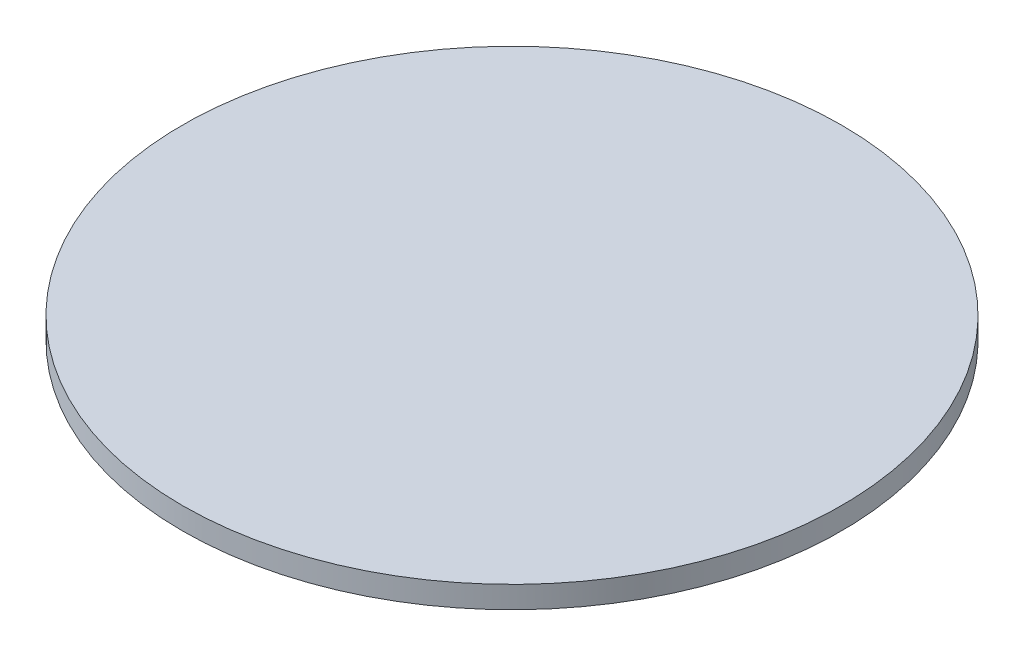
ISO-10303-21;
HEADER;
FILE_DESCRIPTION(('STEP AP214'),'2;1');
FILE_NAME('part.step','',(''),(''),'','','');
FILE_SCHEMA(('AUTOMOTIVE_DESIGN { 1 0 10303 214 1 1 1 1 }'));
ENDSEC;
DATA;
#1=APPLICATION_CONTEXT('core data for automotive mechanical design processes');
#2=APPLICATION_PROTOCOL_DEFINITION('international standard','automotive_design',2000,#1);
#3=PRODUCT_CONTEXT('',#1,'mechanical');
#4=PRODUCT('Part','Part','',(#3));
#5=PRODUCT_RELATED_PRODUCT_CATEGORY('part','',(#4));
#6=PRODUCT_DEFINITION_FORMATION('','',#4);
#7=PRODUCT_DEFINITION_CONTEXT('part definition',#1,'design');
#8=PRODUCT_DEFINITION('design','',#6,#7);
#9=PRODUCT_DEFINITION_SHAPE('','',#8);
#10=(LENGTH_UNIT() NAMED_UNIT(*) SI_UNIT(.MILLI.,.METRE.));
#11=(NAMED_UNIT(*) PLANE_ANGLE_UNIT() SI_UNIT($,.RADIAN.));
#12=(NAMED_UNIT(*) SI_UNIT($,.STERADIAN.) SOLID_ANGLE_UNIT());
#13=UNCERTAINTY_MEASURE_WITH_UNIT(LENGTH_MEASURE(1.E-05),#10,'distance_accuracy_value','');
#14=(GEOMETRIC_REPRESENTATION_CONTEXT(3) GLOBAL_UNCERTAINTY_ASSIGNED_CONTEXT((#13)) GLOBAL_UNIT_ASSIGNED_CONTEXT((#10,
#11,#12)) REPRESENTATION_CONTEXT('',''));
#15=CARTESIAN_POINT('',(0.,0.,0.));
#16=DIRECTION('',(0.,0.,1.));
#17=DIRECTION('',(1.,0.,0.));
#18=AXIS2_PLACEMENT_3D('',#15,#16,#17);
#19=CARTESIAN_POINT('',(0.,-1.,0.));
#20=DIRECTION('',(0.,1.,0.));
#21=DIRECTION('',(0.,0.,1.));
#22=AXIS2_PLACEMENT_3D('',#19,#20,#21);
#23=CYLINDRICAL_SURFACE('',#22,10.);
#24=DIRECTION('',(0.,1.,0.));
#25=VECTOR('',#24,1.);
#26=CARTESIAN_POINT('',(-7.07106781186546,-2.,-7.07106781186549));
#27=LINE('',#26,#25);
#28=CARTESIAN_POINT('',(-7.07106781186546,-2.,-7.07106781186549));
#29=VERTEX_POINT('',#28);
#30=CARTESIAN_POINT('',(-7.07106781186546,0.,-7.07106781186549));
#31=VERTEX_POINT('',#30);
#32=EDGE_CURVE('E177',#29,#31,#27,.T.);
#33=ORIENTED_EDGE('',*,*,#32,.T.);
#34=CARTESIAN_POINT('',(0.,0.,0.));
#35=DIRECTION('',(0.,1.,0.));
#36=DIRECTION('',(0.,0.,1.));
#37=AXIS2_PLACEMENT_3D('',#34,#35,#36);
#38=CIRCLE('',#37,10.);
#39=CARTESIAN_POINT('',(7.73755751632147,0.,6.33484046220717));
#40=VERTEX_POINT('',#39);
#41=EDGE_CURVE('E11',#40,#31,#38,.T.);
#42=ORIENTED_EDGE('',*,*,#41,.F.);
#43=DIRECTION('',(0.,-1.,0.));
#44=VECTOR('',#43,1.);
#45=CARTESIAN_POINT('',(7.73755751632147,2.,6.33484046220717));
#46=LINE('',#45,#44);
#47=CARTESIAN_POINT('',(7.73755751632147,-1.,6.33484046220717));
#48=VERTEX_POINT('',#47);
#49=EDGE_CURVE('E158',#40,#48,#46,.T.);
#50=ORIENTED_EDGE('',*,*,#49,.T.);
#51=CARTESIAN_POINT('',(0.,-1.,0.));
#52=DIRECTION('',(0.,1.,0.));
#53=DIRECTION('',(0.,0.,1.));
#54=AXIS2_PLACEMENT_3D('',#51,#52,#53);
#55=CIRCLE('',#54,10.);
#56=CARTESIAN_POINT('',(7.07106781186549,-1.,-7.07106781186546));
#57=VERTEX_POINT('',#56);
#58=EDGE_CURVE('E201',#48,#57,#55,.T.);
#59=ORIENTED_EDGE('',*,*,#58,.T.);
#60=DIRECTION('',(0.,1.,0.));
#61=VECTOR('',#60,1.);
#62=CARTESIAN_POINT('',(7.07106781186549,-2.,-7.07106781186546));
#63=LINE('',#62,#61);
#64=CARTESIAN_POINT('',(7.07106781186549,-2.,-7.07106781186546));
#65=VERTEX_POINT('',#64);
#66=EDGE_CURVE('E206',#65,#57,#63,.T.);
#67=ORIENTED_EDGE('',*,*,#66,.F.);
#68=CARTESIAN_POINT('',(0.,-2.,0.));
#69=DIRECTION('',(0.,-1.,0.));
#70=DIRECTION('',(0.,0.,-1.));
#71=AXIS2_PLACEMENT_3D('',#68,#69,#70);
#72=CIRCLE('',#71,10.);
#73=EDGE_CURVE('E213',#29,#65,#72,.T.);
#74=ORIENTED_EDGE('',*,*,#73,.F.);
#75=EDGE_LOOP('',(#33,#42,#50,#59,#67,#74));
#76=FACE_BOUND('',#75,.T.);
#77=ADVANCED_FACE('F35',(#76),#23,.T.);
#78=CARTESIAN_POINT('',(-7.73276681866139,0.,-6.34068744918163));
#79=VERTEX_POINT('',#78);
#80=CARTESIAN_POINT('',(7.07106781186546,0.,7.07106781186549));
#81=VERTEX_POINT('',#80);
#82=EDGE_CURVE('E42',#79,#81,#38,.T.);
#83=ORIENTED_EDGE('',*,*,#82,.F.);
#84=DIRECTION('',(0.,-1.,0.));
#85=VECTOR('',#84,1.);
#86=CARTESIAN_POINT('',(-7.73276681866139,2.,-6.34068744918163));
#87=LINE('',#86,#85);
#88=CARTESIAN_POINT('',(-7.73276681866139,-1.,-6.34068744918163));
#89=VERTEX_POINT('',#88);
#90=EDGE_CURVE('E139',#79,#89,#87,.T.);
#91=ORIENTED_EDGE('',*,*,#90,.T.);
#92=CARTESIAN_POINT('',(0.,-1.,0.));
#93=DIRECTION('',(0.,1.,0.));
#94=DIRECTION('',(0.,0.,-1.));
#95=AXIS2_PLACEMENT_3D('',#92,#93,#94);
#96=CIRCLE('',#95,10.);
#97=CARTESIAN_POINT('',(-7.07106781186549,-1.,7.07106781186546));
#98=VERTEX_POINT('',#97);
#99=EDGE_CURVE('E124',#89,#98,#96,.T.);
#100=ORIENTED_EDGE('',*,*,#99,.T.);
#101=DIRECTION('',(0.,1.,0.));
#102=VECTOR('',#101,1.);
#103=CARTESIAN_POINT('',(-7.07106781186549,-2.,7.07106781186546));
#104=LINE('',#103,#102);
#105=CARTESIAN_POINT('',(-7.07106781186549,-2.,7.07106781186546));
#106=VERTEX_POINT('',#105);
#107=EDGE_CURVE('E186',#106,#98,#104,.T.);
#108=ORIENTED_EDGE('',*,*,#107,.F.);
#109=CARTESIAN_POINT('',(7.07106781186546,-2.,7.07106781186549));
#110=VERTEX_POINT('',#109);
#111=EDGE_CURVE('E214',#110,#106,#72,.T.);
#112=ORIENTED_EDGE('',*,*,#111,.F.);
#113=DIRECTION('',(0.,1.,0.));
#114=VECTOR('',#113,1.);
#115=CARTESIAN_POINT('',(7.07106781186546,-2.,7.07106781186549));
#116=LINE('',#115,#114);
#117=EDGE_CURVE('E209',#110,#81,#116,.T.);
#118=ORIENTED_EDGE('',*,*,#117,.T.);
#119=EDGE_LOOP('',(#83,#91,#100,#108,#112,#118));
#120=FACE_BOUND('',#119,.T.);
#121=ADVANCED_FACE('F140',(#120),#23,.T.);
#122=CARTESIAN_POINT('',(0.,0.,0.));
#123=DIRECTION('',(0.,1.,0.));
#124=DIRECTION('',(0.,0.,1.));
#125=AXIS2_PLACEMENT_3D('',#122,#123,#124);
#126=PLANE('',#125);
#127=CARTESIAN_POINT('',(0.,0.,0.));
#128=DIRECTION('',(0.,1.,0.));
#129=DIRECTION('',(0.,0.,1.));
#130=AXIS2_PLACEMENT_3D('',#127,#128,#129);
#131=CIRCLE('',#130,30.);
#132=CARTESIAN_POINT('',(0.,0.,30.));
#133=VERTEX_POINT('',#132);
#134=EDGE_CURVE('E217',#133,#133,#131,.T.);
#135=ORIENTED_EDGE('',*,*,#134,.F.);
#136=EDGE_LOOP('',(#135));
#137=FACE_BOUND('',#136,.T.);
#138=DIRECTION('',(0.707106781186547,0.,0.707106781186548));
#139=VECTOR('',#138,1.);
#140=CARTESIAN_POINT('',(0.,0.,0.));
#141=LINE('',#140,#139);
#142=CARTESIAN_POINT('',(-9.19238815542513,0.,-9.19238815542516));
#143=VERTEX_POINT('',#142);
#144=EDGE_CURVE('E154',#143,#31,#141,.T.);
#145=ORIENTED_EDGE('',*,*,#144,.F.);
#146=CARTESIAN_POINT('',(0.,0.,0.));
#147=DIRECTION('',(0.,1.,0.));
#148=DIRECTION('',(0.,0.,1.));
#149=AXIS2_PLACEMENT_3D('',#146,#147,#148);
#150=CIRCLE('',#149,13.);
#151=CARTESIAN_POINT('',(-10.057468336274,0.,-8.23694911146399));
#152=VERTEX_POINT('',#151);
#153=EDGE_CURVE('E56',#152,#143,#150,.F.);
#154=ORIENTED_EDGE('',*,*,#153,.F.);
#155=DIRECTION('',(-0.774898549778318,0.,-0.632085625173883));
#156=VECTOR('',#155,1.);
#157=CARTESIAN_POINT('',(0.0161932499756489,0.,-0.0198519400261257));
#158=LINE('',#157,#156);
#159=EDGE_CURVE('E151',#79,#152,#158,.T.);
#160=ORIENTED_EDGE('',*,*,#159,.F.);
#161=ORIENTED_EDGE('',*,*,#82,.T.);
#162=DIRECTION('',(-0.707106781186551,0.,-0.707106781186544));
#163=VECTOR('',#162,1.);
#164=CARTESIAN_POINT('',(0.,0.,0.));
#165=LINE('',#164,#163);
#166=CARTESIAN_POINT('',(9.19238815542511,0.,9.19238815542512));
#167=VERTEX_POINT('',#166);
#168=EDGE_CURVE('E135',#167,#81,#165,.T.);
#169=ORIENTED_EDGE('',*,*,#168,.F.);
#170=CARTESIAN_POINT('',(0.,0.,0.));
#171=DIRECTION('',(0.,1.,0.));
#172=DIRECTION('',(0.,0.,1.));
#173=AXIS2_PLACEMENT_3D('',#170,#171,#172);
#174=CIRCLE('',#173,13.);
#175=CARTESIAN_POINT('',(10.0765219435879,0.,8.21362925389202));
#176=VERTEX_POINT('',#175);
#177=EDGE_CURVE('E165',#176,#167,#174,.F.);
#178=ORIENTED_EDGE('',*,*,#177,.F.);
#179=DIRECTION('',(0.779628738922517,0.,0.626241989526481));
#180=VECTOR('',#179,1.);
#181=CARTESIAN_POINT('',(-0.0583909707666999,0.,0.0726927923464941));
#182=LINE('',#181,#180);
#183=EDGE_CURVE('E163',#40,#176,#182,.T.);
#184=ORIENTED_EDGE('',*,*,#183,.F.);
#185=ORIENTED_EDGE('',*,*,#41,.T.);
#186=EDGE_LOOP('',(#145,#154,#160,#161,#169,#178,#184,#185));
#187=FACE_BOUND('',#186,.T.);
#188=ADVANCED_FACE('F225',(#137,#187),#126,.F.);
#189=CARTESIAN_POINT('',(0.,-1.,0.));
#190=DIRECTION('',(0.,-1.,0.));
#191=DIRECTION('',(0.,0.,-1.));
#192=AXIS2_PLACEMENT_3D('',#189,#190,#191);
#193=PLANE('',#192);
#194=DIRECTION('',(0.774898549778319,0.,0.632085625173883));
#195=VECTOR('',#194,1.);
#196=CARTESIAN_POINT('',(-10.057468336274,-1.,-8.23694911146399));
#197=LINE('',#196,#195);
#198=CARTESIAN_POINT('',(-10.057468336274,-1.,-8.23694911146399));
#199=VERTEX_POINT('',#198);
#200=EDGE_CURVE('E129',#199,#89,#197,.T.);
#201=ORIENTED_EDGE('',*,*,#200,.F.);
#202=CARTESIAN_POINT('',(0.,-1.,0.));
#203=DIRECTION('',(0.,-1.,0.));
#204=DIRECTION('',(0.,0.,-1.));
#205=AXIS2_PLACEMENT_3D('',#202,#203,#204);
#206=CIRCLE('',#205,13.);
#207=CARTESIAN_POINT('',(-9.19238815542516,-1.,9.19238815542512));
#208=VERTEX_POINT('',#207);
#209=EDGE_CURVE('E173',#208,#199,#206,.T.);
#210=ORIENTED_EDGE('',*,*,#209,.F.);
#211=DIRECTION('',(-0.707106781186549,0.,0.707106781186546));
#212=VECTOR('',#211,1.);
#213=CARTESIAN_POINT('',(-7.07106781186549,-1.,7.07106781186546));
#214=LINE('',#213,#212);
#215=EDGE_CURVE('E131',#98,#208,#214,.T.);
#216=ORIENTED_EDGE('',*,*,#215,.F.);
#217=ORIENTED_EDGE('',*,*,#99,.F.);
#218=EDGE_LOOP('',(#201,#210,#216,#217));
#219=FACE_BOUND('',#218,.T.);
#220=ADVANCED_FACE('F126',(#219),#193,.F.);
#221=CARTESIAN_POINT('',(0.,-1.,0.));
#222=DIRECTION('',(0.,1.,0.));
#223=DIRECTION('',(0.,0.,1.));
#224=AXIS2_PLACEMENT_3D('',#221,#222,#223);
#225=PLANE('',#224);
#226=ORIENTED_EDGE('',*,*,#58,.F.);
#227=DIRECTION('',(-0.779628738922517,0.,-0.626241989526481));
#228=VECTOR('',#227,1.);
#229=CARTESIAN_POINT('',(10.0765219435879,-1.,8.21362925389202));
#230=LINE('',#229,#228);
#231=CARTESIAN_POINT('',(10.0765219435879,-1.,8.21362925389202));
#232=VERTEX_POINT('',#231);
#233=EDGE_CURVE('E156',#232,#48,#230,.T.);
#234=ORIENTED_EDGE('',*,*,#233,.F.);
#235=CARTESIAN_POINT('',(0.,-1.,0.));
#236=DIRECTION('',(0.,-1.,0.));
#237=DIRECTION('',(0.,0.,1.));
#238=AXIS2_PLACEMENT_3D('',#235,#236,#237);
#239=CIRCLE('',#238,13.);
#240=CARTESIAN_POINT('',(9.19238815542512,-1.,-9.19238815542511));
#241=VERTEX_POINT('',#240);
#242=EDGE_CURVE('E188',#241,#232,#239,.T.);
#243=ORIENTED_EDGE('',*,*,#242,.F.);
#244=DIRECTION('',(0.707106781186544,0.,-0.707106781186551));
#245=VECTOR('',#244,1.);
#246=CARTESIAN_POINT('',(7.07106781186549,-1.,-7.07106781186546));
#247=LINE('',#246,#245);
#248=EDGE_CURVE('E193',#57,#241,#247,.T.);
#249=ORIENTED_EDGE('',*,*,#248,.F.);
#250=EDGE_LOOP('',(#226,#234,#243,#249));
#251=FACE_BOUND('',#250,.T.);
#252=ADVANCED_FACE('F254',(#251),#225,.T.);
#253=CARTESIAN_POINT('',(0.,2.,0.));
#254=DIRECTION('',(0.,-1.,0.));
#255=DIRECTION('',(0.,0.,-1.));
#256=AXIS2_PLACEMENT_3D('',#253,#254,#255);
#257=CYLINDRICAL_SURFACE('',#256,30.);
#258=CARTESIAN_POINT('',(0.,2.,0.));
#259=DIRECTION('',(0.,1.,0.));
#260=DIRECTION('',(0.,0.,1.));
#261=AXIS2_PLACEMENT_3D('',#258,#259,#260);
#262=CIRCLE('',#261,30.);
#263=CARTESIAN_POINT('',(0.,2.,30.));
#264=VERTEX_POINT('',#263);
#265=EDGE_CURVE('E218',#264,#264,#262,.T.);
#266=ORIENTED_EDGE('',*,*,#265,.F.);
#267=EDGE_LOOP('',(#266));
#268=FACE_BOUND('',#267,.T.);
#269=ORIENTED_EDGE('',*,*,#134,.T.);
#270=EDGE_LOOP('',(#269));
#271=FACE_BOUND('',#270,.T.);
#272=ADVANCED_FACE('F223',(#268,#271),#257,.T.);
#273=CARTESIAN_POINT('',(0.,2.,0.));
#274=DIRECTION('',(0.,1.,0.));
#275=DIRECTION('',(0.,0.,1.));
#276=AXIS2_PLACEMENT_3D('',#273,#274,#275);
#277=PLANE('',#276);
#278=ORIENTED_EDGE('',*,*,#265,.T.);
#279=EDGE_LOOP('',(#278));
#280=FACE_BOUND('',#279,.T.);
#281=ADVANCED_FACE('F301',(#280),#277,.T.);
#282=CARTESIAN_POINT('',(0.,-2.,0.));
#283=DIRECTION('',(0.,-1.,0.));
#284=DIRECTION('',(0.,0.,-1.));
#285=AXIS2_PLACEMENT_3D('',#282,#283,#284);
#286=PLANE('',#285);
#287=ORIENTED_EDGE('',*,*,#111,.T.);
#288=DIRECTION('',(-0.707106781186549,0.,0.707106781186546));
#289=VECTOR('',#288,1.);
#290=CARTESIAN_POINT('',(-7.07106781186549,-2.,7.07106781186546));
#291=LINE('',#290,#289);
#292=CARTESIAN_POINT('',(-9.19238815542516,-2.,9.19238815542512));
#293=VERTEX_POINT('',#292);
#294=EDGE_CURVE('E170',#106,#293,#291,.T.);
#295=ORIENTED_EDGE('',*,*,#294,.T.);
#296=CARTESIAN_POINT('',(0.,-2.,0.));
#297=DIRECTION('',(0.,-1.,0.));
#298=DIRECTION('',(0.,0.,-1.));
#299=AXIS2_PLACEMENT_3D('',#296,#297,#298);
#300=CIRCLE('',#299,13.);
#301=CARTESIAN_POINT('',(-9.19238815542513,-2.,-9.19238815542516));
#302=VERTEX_POINT('',#301);
#303=EDGE_CURVE('E172',#293,#302,#300,.T.);
#304=ORIENTED_EDGE('',*,*,#303,.T.);
#305=DIRECTION('',(0.707106781186546,0.,0.707106781186549));
#306=VECTOR('',#305,1.);
#307=CARTESIAN_POINT('',(-7.07106781186546,-2.,-7.07106781186549));
#308=LINE('',#307,#306);
#309=EDGE_CURVE('E175',#302,#29,#308,.T.);
#310=ORIENTED_EDGE('',*,*,#309,.T.);
#311=ORIENTED_EDGE('',*,*,#73,.T.);
#312=DIRECTION('',(0.707106781186544,0.,-0.707106781186551));
#313=VECTOR('',#312,1.);
#314=CARTESIAN_POINT('',(7.07106781186549,-2.,-7.07106781186546));
#315=LINE('',#314,#313);
#316=CARTESIAN_POINT('',(9.19238815542512,-2.,-9.19238815542511));
#317=VERTEX_POINT('',#316);
#318=EDGE_CURVE('E196',#65,#317,#315,.T.);
#319=ORIENTED_EDGE('',*,*,#318,.T.);
#320=CARTESIAN_POINT('',(0.,-2.,0.));
#321=DIRECTION('',(0.,-1.,0.));
#322=DIRECTION('',(0.,0.,1.));
#323=AXIS2_PLACEMENT_3D('',#320,#321,#322);
#324=CIRCLE('',#323,13.);
#325=CARTESIAN_POINT('',(9.19238815542511,-2.,9.19238815542512));
#326=VERTEX_POINT('',#325);
#327=EDGE_CURVE('E189',#317,#326,#324,.T.);
#328=ORIENTED_EDGE('',*,*,#327,.T.);
#329=DIRECTION('',(-0.707106781186551,0.,-0.707106781186544));
#330=VECTOR('',#329,1.);
#331=CARTESIAN_POINT('',(7.07106781186546,-2.,7.07106781186549));
#332=LINE('',#331,#330);
#333=EDGE_CURVE('E192',#326,#110,#332,.T.);
#334=ORIENTED_EDGE('',*,*,#333,.T.);
#335=EDGE_LOOP('',(#287,#295,#304,#310,#311,#319,#328,#334));
#336=FACE_BOUND('',#335,.T.);
#337=ADVANCED_FACE('F238',(#336),#286,.T.);
#338=CARTESIAN_POINT('',(0.,-2.,0.));
#339=DIRECTION('',(0.,1.,0.));
#340=DIRECTION('',(0.,0.,1.));
#341=AXIS2_PLACEMENT_3D('',#338,#339,#340);
#342=CYLINDRICAL_SURFACE('',#341,13.);
#343=ORIENTED_EDGE('',*,*,#242,.T.);
#344=DIRECTION('',(0.,-1.,0.));
#345=VECTOR('',#344,1.);
#346=CARTESIAN_POINT('',(10.0765219435879,2.,8.21362925389202));
#347=LINE('',#346,#345);
#348=EDGE_CURVE('E161',#176,#232,#347,.T.);
#349=ORIENTED_EDGE('',*,*,#348,.F.);
#350=ORIENTED_EDGE('',*,*,#177,.T.);
#351=DIRECTION('',(0.,1.,0.));
#352=VECTOR('',#351,1.);
#353=CARTESIAN_POINT('',(9.19238815542511,-2.,9.19238815542512));
#354=LINE('',#353,#352);
#355=EDGE_CURVE('E211',#326,#167,#354,.T.);
#356=ORIENTED_EDGE('',*,*,#355,.F.);
#357=ORIENTED_EDGE('',*,*,#327,.F.);
#358=DIRECTION('',(0.,1.,0.));
#359=VECTOR('',#358,1.);
#360=CARTESIAN_POINT('',(9.19238815542512,-2.,-9.19238815542511));
#361=LINE('',#360,#359);
#362=EDGE_CURVE('E198',#317,#241,#361,.T.);
#363=ORIENTED_EDGE('',*,*,#362,.T.);
#364=EDGE_LOOP('',(#343,#349,#350,#356,#357,#363));
#365=FACE_BOUND('',#364,.T.);
#366=ADVANCED_FACE('F247',(#365),#342,.T.);
#367=CARTESIAN_POINT('',(7.07106781186546,-2.,7.07106781186549));
#368=DIRECTION('',(0.707106781186544,0.,-0.707106781186551));
#369=DIRECTION('',(-0.707106781186551,0.,-0.707106781186544));
#370=AXIS2_PLACEMENT_3D('',#367,#368,#369);
#371=PLANE('',#370);
#372=ORIENTED_EDGE('',*,*,#355,.T.);
#373=ORIENTED_EDGE('',*,*,#168,.T.);
#374=ORIENTED_EDGE('',*,*,#117,.F.);
#375=ORIENTED_EDGE('',*,*,#333,.F.);
#376=EDGE_LOOP('',(#372,#373,#374,#375));
#377=FACE_BOUND('',#376,.T.);
#378=ADVANCED_FACE('F242',(#377),#371,.F.);
#379=CARTESIAN_POINT('',(7.07106781186549,-2.,-7.07106781186546));
#380=DIRECTION('',(0.707106781186551,0.,0.707106781186544));
#381=DIRECTION('',(0.707106781186544,0.,-0.707106781186551));
#382=AXIS2_PLACEMENT_3D('',#379,#380,#381);
#383=PLANE('',#382);
#384=ORIENTED_EDGE('',*,*,#248,.T.);
#385=ORIENTED_EDGE('',*,*,#362,.F.);
#386=ORIENTED_EDGE('',*,*,#318,.F.);
#387=ORIENTED_EDGE('',*,*,#66,.T.);
#388=EDGE_LOOP('',(#384,#385,#386,#387));
#389=FACE_BOUND('',#388,.T.);
#390=ADVANCED_FACE('F261',(#389),#383,.F.);
#391=CARTESIAN_POINT('',(-7.07106781186549,-2.,7.07106781186546));
#392=DIRECTION('',(-0.707106781186546,0.,-0.70710678118655));
#393=DIRECTION('',(-0.70710678118655,0.,0.707106781186546));
#394=AXIS2_PLACEMENT_3D('',#391,#392,#393);
#395=PLANE('',#394);
#396=ORIENTED_EDGE('',*,*,#215,.T.);
#397=DIRECTION('',(0.,1.,0.));
#398=VECTOR('',#397,1.);
#399=CARTESIAN_POINT('',(-9.19238815542516,-2.,9.19238815542512));
#400=LINE('',#399,#398);
#401=EDGE_CURVE('E183',#293,#208,#400,.T.);
#402=ORIENTED_EDGE('',*,*,#401,.F.);
#403=ORIENTED_EDGE('',*,*,#294,.F.);
#404=ORIENTED_EDGE('',*,*,#107,.T.);
#405=EDGE_LOOP('',(#396,#402,#403,#404));
#406=FACE_BOUND('',#405,.T.);
#407=ADVANCED_FACE('F235',(#406),#395,.F.);
#408=CARTESIAN_POINT('',(0.,-2.,0.));
#409=DIRECTION('',(0.,1.,0.));
#410=DIRECTION('',(0.,0.,1.));
#411=AXIS2_PLACEMENT_3D('',#408,#409,#410);
#412=CYLINDRICAL_SURFACE('',#411,13.);
#413=ORIENTED_EDGE('',*,*,#209,.T.);
#414=DIRECTION('',(0.,-1.,0.));
#415=VECTOR('',#414,1.);
#416=CARTESIAN_POINT('',(-10.057468336274,2.,-8.23694911146399));
#417=LINE('',#416,#415);
#418=EDGE_CURVE('E143',#152,#199,#417,.T.);
#419=ORIENTED_EDGE('',*,*,#418,.F.);
#420=ORIENTED_EDGE('',*,*,#153,.T.);
#421=DIRECTION('',(0.,1.,0.));
#422=VECTOR('',#421,1.);
#423=CARTESIAN_POINT('',(-9.19238815542513,-2.,-9.19238815542516));
#424=LINE('',#423,#422);
#425=EDGE_CURVE('E49',#302,#143,#424,.T.);
#426=ORIENTED_EDGE('',*,*,#425,.F.);
#427=ORIENTED_EDGE('',*,*,#303,.F.);
#428=ORIENTED_EDGE('',*,*,#401,.T.);
#429=EDGE_LOOP('',(#413,#419,#420,#426,#427,#428));
#430=FACE_BOUND('',#429,.T.);
#431=ADVANCED_FACE('F231',(#430),#412,.T.);
#432=CARTESIAN_POINT('',(-7.07106781186546,-2.,-7.07106781186549));
#433=DIRECTION('',(-0.707106781186549,0.,0.707106781186546));
#434=DIRECTION('',(0.707106781186546,0.,0.707106781186549));
#435=AXIS2_PLACEMENT_3D('',#432,#433,#434);
#436=PLANE('',#435);
#437=ORIENTED_EDGE('',*,*,#425,.T.);
#438=ORIENTED_EDGE('',*,*,#144,.T.);
#439=ORIENTED_EDGE('',*,*,#32,.F.);
#440=ORIENTED_EDGE('',*,*,#309,.F.);
#441=EDGE_LOOP('',(#437,#438,#439,#440));
#442=FACE_BOUND('',#441,.T.);
#443=ADVANCED_FACE('F263',(#442),#436,.F.);
#444=CARTESIAN_POINT('',(10.0765219435879,2.,8.21362925389202));
#445=DIRECTION('',(-0.626241989526481,0.,0.779628738922517));
#446=DIRECTION('',(0.779628738922517,0.,0.626241989526481));
#447=AXIS2_PLACEMENT_3D('',#444,#445,#446);
#448=PLANE('',#447);
#449=ORIENTED_EDGE('',*,*,#49,.F.);
#450=ORIENTED_EDGE('',*,*,#183,.T.);
#451=ORIENTED_EDGE('',*,*,#348,.T.);
#452=ORIENTED_EDGE('',*,*,#233,.T.);
#453=EDGE_LOOP('',(#449,#450,#451,#452));
#454=FACE_BOUND('',#453,.T.);
#455=ADVANCED_FACE('F251',(#454),#448,.F.);
#456=CARTESIAN_POINT('',(-10.057468336274,2.,-8.23694911146399));
#457=DIRECTION('',(0.632085625173883,0.,-0.774898549778318));
#458=DIRECTION('',(-0.774898549778318,0.,-0.632085625173883));
#459=AXIS2_PLACEMENT_3D('',#456,#457,#458);
#460=PLANE('',#459);
#461=ORIENTED_EDGE('',*,*,#90,.F.);
#462=ORIENTED_EDGE('',*,*,#159,.T.);
#463=ORIENTED_EDGE('',*,*,#418,.T.);
#464=ORIENTED_EDGE('',*,*,#200,.T.);
#465=EDGE_LOOP('',(#461,#462,#463,#464));
#466=FACE_BOUND('',#465,.T.);
#467=ADVANCED_FACE('F146',(#466),#460,.F.);
#468=CLOSED_SHELL('',(#77,#121,#188,#220,#252,#272,#281,#337,#366,#378,#390,#407,#431,#443,#455,#467));
#469=MANIFOLD_SOLID_BREP('B2',#468);
#470=ADVANCED_BREP_SHAPE_REPRESENTATION('',(#18,#469),#14);
#471=SHAPE_DEFINITION_REPRESENTATION(#9,#470);
ENDSEC;
END-ISO-10303-21;
